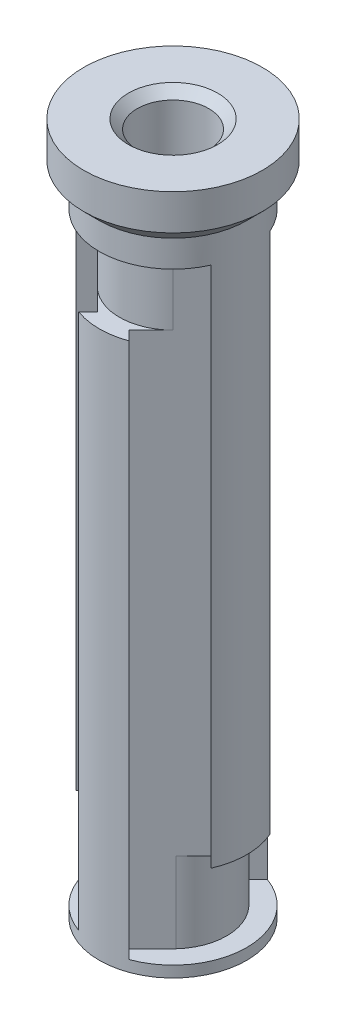
ISO-10303-21;
HEADER;
FILE_DESCRIPTION(('STEP AP214'),'2;1');
FILE_NAME('part.step','',(''),(''),'','','');
FILE_SCHEMA(('AUTOMOTIVE_DESIGN { 1 0 10303 214 1 1 1 1 }'));
ENDSEC;
DATA;
#1=APPLICATION_CONTEXT('core data for automotive mechanical design processes');
#2=APPLICATION_PROTOCOL_DEFINITION('international standard','automotive_design',2000,#1);
#3=PRODUCT_CONTEXT('',#1,'mechanical');
#4=PRODUCT('Part','Part','',(#3));
#5=PRODUCT_RELATED_PRODUCT_CATEGORY('part','',(#4));
#6=PRODUCT_DEFINITION_FORMATION('','',#4);
#7=PRODUCT_DEFINITION_CONTEXT('part definition',#1,'design');
#8=PRODUCT_DEFINITION('design','',#6,#7);
#9=PRODUCT_DEFINITION_SHAPE('','',#8);
#10=(LENGTH_UNIT() NAMED_UNIT(*) SI_UNIT(.MILLI.,.METRE.));
#11=(NAMED_UNIT(*) PLANE_ANGLE_UNIT() SI_UNIT($,.RADIAN.));
#12=(NAMED_UNIT(*) SI_UNIT($,.STERADIAN.) SOLID_ANGLE_UNIT());
#13=UNCERTAINTY_MEASURE_WITH_UNIT(LENGTH_MEASURE(1.E-05),#10,'distance_accuracy_value','');
#14=(GEOMETRIC_REPRESENTATION_CONTEXT(3) GLOBAL_UNCERTAINTY_ASSIGNED_CONTEXT((#13)) GLOBAL_UNIT_ASSIGNED_CONTEXT((#10,
#11,#12)) REPRESENTATION_CONTEXT('',''));
#15=CARTESIAN_POINT('',(0.,0.,0.));
#16=DIRECTION('',(0.,0.,1.));
#17=DIRECTION('',(1.,0.,0.));
#18=AXIS2_PLACEMENT_3D('',#15,#16,#17);
#19=CARTESIAN_POINT('',(0.,0.,0.));
#20=DIRECTION('',(0.,1.,0.));
#21=DIRECTION('',(0.,0.,1.));
#22=AXIS2_PLACEMENT_3D('',#19,#20,#21);
#23=CYLINDRICAL_SURFACE('',#22,8.25000000000001);
#24=CARTESIAN_POINT('',(0.,-5.75,0.));
#25=DIRECTION('',(0.,1.,0.));
#26=DIRECTION('',(0.,0.,1.));
#27=AXIS2_PLACEMENT_3D('',#24,#25,#26);
#28=CIRCLE('',#27,8.25);
#29=CARTESIAN_POINT('',(0.,-5.75,8.25));
#30=VERTEX_POINT('',#29);
#31=EDGE_CURVE('E315',#30,#30,#28,.T.);
#32=ORIENTED_EDGE('',*,*,#31,.F.);
#33=EDGE_LOOP('',(#32));
#34=FACE_BOUND('',#33,.T.);
#35=CARTESIAN_POINT('',(0.,-67.25,0.));
#36=DIRECTION('',(0.,1.,0.));
#37=DIRECTION('',(0.,0.,-1.));
#38=AXIS2_PLACEMENT_3D('',#35,#36,#37);
#39=CIRCLE('',#38,8.25000000000001);
#40=CARTESIAN_POINT('',(-7.5555866233807,-67.25,-3.31294593626136));
#41=VERTEX_POINT('',#40);
#42=CARTESIAN_POINT('',(-7.5555866233807,-67.25,3.31294593626136));
#43=VERTEX_POINT('',#42);
#44=EDGE_CURVE('E495',#41,#43,#39,.T.);
#45=ORIENTED_EDGE('',*,*,#44,.T.);
#46=DIRECTION('',(0.,1.,0.));
#47=VECTOR('',#46,1.);
#48=CARTESIAN_POINT('',(-7.5555866233807,-16.25,3.31294593626136));
#49=LINE('',#48,#47);
#50=CARTESIAN_POINT('',(-7.5555866233807,-8.75,3.31294593626136));
#51=VERTEX_POINT('',#50);
#52=EDGE_CURVE('E246',#43,#51,#49,.T.);
#53=ORIENTED_EDGE('',*,*,#52,.T.);
#54=CARTESIAN_POINT('',(0.,-8.75,0.));
#55=DIRECTION('',(0.,1.,0.));
#56=DIRECTION('',(0.,0.,1.));
#57=AXIS2_PLACEMENT_3D('',#54,#55,#56);
#58=CIRCLE('',#57,8.25000000000001);
#59=CARTESIAN_POINT('',(7.55558662338068,-8.75,3.31294593626142));
#60=VERTEX_POINT('',#59);
#61=EDGE_CURVE('E239',#60,#51,#58,.F.);
#62=ORIENTED_EDGE('',*,*,#61,.F.);
#63=DIRECTION('',(0.,1.,0.));
#64=VECTOR('',#63,1.);
#65=CARTESIAN_POINT('',(7.55558662338068,-16.25,3.31294593626142));
#66=LINE('',#65,#64);
#67=CARTESIAN_POINT('',(7.55558662338068,-67.25,3.31294593626141));
#68=VERTEX_POINT('',#67);
#69=EDGE_CURVE('E222',#68,#60,#66,.T.);
#70=ORIENTED_EDGE('',*,*,#69,.F.);
#71=CARTESIAN_POINT('',(0.,-67.25,0.));
#72=DIRECTION('',(0.,1.,0.));
#73=DIRECTION('',(0.,0.,1.));
#74=AXIS2_PLACEMENT_3D('',#71,#72,#73);
#75=CIRCLE('',#74,8.25000000000001);
#76=CARTESIAN_POINT('',(7.55558662338068,-67.25,-3.31294593626141));
#77=VERTEX_POINT('',#76);
#78=EDGE_CURVE('E430',#68,#77,#75,.T.);
#79=ORIENTED_EDGE('',*,*,#78,.T.);
#80=DIRECTION('',(0.,1.,0.));
#81=VECTOR('',#80,1.);
#82=CARTESIAN_POINT('',(7.55558662338068,-16.25,-3.31294593626142));
#83=LINE('',#82,#81);
#84=CARTESIAN_POINT('',(7.55558662338068,-8.75,-3.31294593626142));
#85=VERTEX_POINT('',#84);
#86=EDGE_CURVE('E305',#77,#85,#83,.T.);
#87=ORIENTED_EDGE('',*,*,#86,.T.);
#88=CARTESIAN_POINT('',(0.,-8.75,0.));
#89=DIRECTION('',(0.,1.,0.));
#90=DIRECTION('',(0.,0.,1.));
#91=AXIS2_PLACEMENT_3D('',#88,#89,#90);
#92=CIRCLE('',#91,8.25000000000001);
#93=CARTESIAN_POINT('',(-7.55558662338071,-8.75,-3.31294593626136));
#94=VERTEX_POINT('',#93);
#95=EDGE_CURVE('E289',#85,#94,#92,.T.);
#96=ORIENTED_EDGE('',*,*,#95,.T.);
#97=DIRECTION('',(0.,1.,0.));
#98=VECTOR('',#97,1.);
#99=CARTESIAN_POINT('',(-7.5555866233807,-16.25,-3.31294593626136));
#100=LINE('',#99,#98);
#101=EDGE_CURVE('E303',#41,#94,#100,.T.);
#102=ORIENTED_EDGE('',*,*,#101,.F.);
#103=EDGE_LOOP('',(#45,#53,#62,#70,#79,#87,#96,#102));
#104=FACE_BOUND('',#103,.T.);
#105=ADVANCED_FACE('F47',(#34,#104),#23,.T.);
#106=CARTESIAN_POINT('',(-4.24264068711931,-16.25,-4.24264068711927));
#107=DIRECTION('',(-0.707106781186551,0.,-0.707106781186544));
#108=DIRECTION('',(-0.707106781186544,0.,0.707106781186551));
#109=AXIS2_PLACEMENT_3D('',#106,#107,#108);
#110=PLANE('',#109);
#111=DIRECTION('',(0.707106781186543,0.,-0.707106781186552));
#112=VECTOR('',#111,1.);
#113=CARTESIAN_POINT('',(-6.36396103067894,-76.25,-2.12132034355961));
#114=LINE('',#113,#112);
#115=CARTESIAN_POINT('',(-4.41941738241596,-76.25,-4.06586399182261));
#116=VERTEX_POINT('',#115);
#117=CARTESIAN_POINT('',(-1.76776695296641,-76.25,-6.7175144212722));
#118=VERTEX_POINT('',#117);
#119=EDGE_CURVE('E85',#116,#118,#114,.T.);
#120=ORIENTED_EDGE('',*,*,#119,.F.);
#121=DIRECTION('',(0.,-1.,0.));
#122=VECTOR('',#121,1.);
#123=CARTESIAN_POINT('',(-4.41941738241596,-67.25,-4.06586399182261));
#124=LINE('',#123,#122);
#125=CARTESIAN_POINT('',(-4.41941738241598,-67.25,-4.06586399182259));
#126=VERTEX_POINT('',#125);
#127=EDGE_CURVE('E417',#116,#126,#124,.F.);
#128=ORIENTED_EDGE('',*,*,#127,.T.);
#129=DIRECTION('',(-0.707106781186544,0.,0.707106781186551));
#130=VECTOR('',#129,1.);
#131=CARTESIAN_POINT('',(-4.24264068711931,-67.25,-4.24264068711927));
#132=LINE('',#131,#130);
#133=CARTESIAN_POINT('',(-6.36396103067894,-67.25,-2.12132034355961));
#134=VERTEX_POINT('',#133);
#135=EDGE_CURVE('E426',#126,#134,#132,.T.);
#136=ORIENTED_EDGE('',*,*,#135,.T.);
#137=DIRECTION('',(0.,1.,0.));
#138=VECTOR('',#137,1.);
#139=CARTESIAN_POINT('',(-6.36396103067894,-16.25,-2.12132034355961));
#140=LINE('',#139,#138);
#141=CARTESIAN_POINT('',(-6.36396103067894,-8.75,-2.12132034355961));
#142=VERTEX_POINT('',#141);
#143=EDGE_CURVE('E301',#134,#142,#140,.T.);
#144=ORIENTED_EDGE('',*,*,#143,.T.);
#145=DIRECTION('',(-0.707106781186544,0.,0.707106781186551));
#146=VECTOR('',#145,1.);
#147=CARTESIAN_POINT('',(-4.24264068711931,-8.75,-4.24264068711927));
#148=LINE('',#147,#146);
#149=CARTESIAN_POINT('',(-4.24264068711931,-8.75,-4.24264068711926));
#150=VERTEX_POINT('',#149);
#151=EDGE_CURVE('E277',#150,#142,#148,.T.);
#152=ORIENTED_EDGE('',*,*,#151,.F.);
#153=DIRECTION('',(0.,1.,0.));
#154=VECTOR('',#153,1.);
#155=CARTESIAN_POINT('',(-4.24264068711931,-16.25,-4.24264068711926));
#156=LINE('',#155,#154);
#157=CARTESIAN_POINT('',(-4.24264068711931,-16.25,-4.24264068711926));
#158=VERTEX_POINT('',#157);
#159=EDGE_CURVE('E297',#158,#150,#156,.T.);
#160=ORIENTED_EDGE('',*,*,#159,.F.);
#161=DIRECTION('',(0.707106781186544,0.,-0.707106781186552));
#162=VECTOR('',#161,1.);
#163=CARTESIAN_POINT('',(-4.24264068711931,-16.25,-4.24264068711926));
#164=LINE('',#163,#162);
#165=CARTESIAN_POINT('',(-1.76776695296641,-16.25,-6.7175144212722));
#166=VERTEX_POINT('',#165);
#167=EDGE_CURVE('E324',#158,#166,#164,.T.);
#168=ORIENTED_EDGE('',*,*,#167,.T.);
#169=DIRECTION('',(0.,1.,0.));
#170=VECTOR('',#169,1.);
#171=CARTESIAN_POINT('',(-1.76776695296641,-76.25,-6.7175144212722));
#172=LINE('',#171,#170);
#173=EDGE_CURVE('E455',#118,#166,#172,.T.);
#174=ORIENTED_EDGE('',*,*,#173,.F.);
#175=EDGE_LOOP('',(#120,#128,#136,#144,#152,#160,#168,#174));
#176=FACE_BOUND('',#175,.T.);
#177=ADVANCED_FACE('F504',(#176),#110,.T.);
#178=CARTESIAN_POINT('',(-2.12132034355963,-16.25,2.12132034355965));
#179=DIRECTION('',(0.707106781186544,0.,-0.707106781186551));
#180=DIRECTION('',(-0.707106781186551,0.,-0.707106781186544));
#181=AXIS2_PLACEMENT_3D('',#178,#179,#180);
#182=PLANE('',#181);
#183=ORIENTED_EDGE('',*,*,#143,.F.);
#184=DIRECTION('',(-0.707106781186551,0.,-0.707106781186544));
#185=VECTOR('',#184,1.);
#186=CARTESIAN_POINT('',(-2.12132034355963,-67.25,2.12132034355965));
#187=LINE('',#186,#185);
#188=EDGE_CURVE('E419',#134,#41,#187,.T.);
#189=ORIENTED_EDGE('',*,*,#188,.T.);
#190=ORIENTED_EDGE('',*,*,#101,.T.);
#191=DIRECTION('',(-0.707106781186551,0.,-0.707106781186544));
#192=VECTOR('',#191,1.);
#193=CARTESIAN_POINT('',(-2.12132034355963,-8.75,2.12132034355965));
#194=LINE('',#193,#192);
#195=EDGE_CURVE('E292',#142,#94,#194,.T.);
#196=ORIENTED_EDGE('',*,*,#195,.F.);
#197=EDGE_LOOP('',(#183,#189,#190,#196));
#198=FACE_BOUND('',#197,.T.);
#199=ADVANCED_FACE('F494',(#198),#182,.T.);
#200=CARTESIAN_POINT('',(-2.12132034355963,-16.25,-2.12132034355965));
#201=DIRECTION('',(-0.707106781186544,0.,-0.707106781186551));
#202=DIRECTION('',(-0.707106781186551,0.,0.707106781186544));
#203=AXIS2_PLACEMENT_3D('',#200,#201,#202);
#204=PLANE('',#203);
#205=DIRECTION('',(-0.707106781186551,0.,0.707106781186544));
#206=VECTOR('',#205,1.);
#207=CARTESIAN_POINT('',(-2.12132034355963,-67.25,-2.12132034355965));
#208=LINE('',#207,#206);
#209=CARTESIAN_POINT('',(-6.36396103067894,-67.25,2.12132034355961));
#210=VERTEX_POINT('',#209);
#211=EDGE_CURVE('E105',#210,#43,#208,.T.);
#212=ORIENTED_EDGE('',*,*,#211,.F.);
#213=DIRECTION('',(0.,1.,0.));
#214=VECTOR('',#213,1.);
#215=CARTESIAN_POINT('',(-6.36396103067894,-16.25,2.12132034355961));
#216=LINE('',#215,#214);
#217=CARTESIAN_POINT('',(-6.36396103067894,-8.75,2.12132034355961));
#218=VERTEX_POINT('',#217);
#219=EDGE_CURVE('E266',#210,#218,#216,.T.);
#220=ORIENTED_EDGE('',*,*,#219,.T.);
#221=DIRECTION('',(-0.707106781186551,0.,0.707106781186544));
#222=VECTOR('',#221,1.);
#223=CARTESIAN_POINT('',(-2.12132034355963,-8.75,-2.12132034355965));
#224=LINE('',#223,#222);
#225=EDGE_CURVE('E261',#218,#51,#224,.T.);
#226=ORIENTED_EDGE('',*,*,#225,.T.);
#227=ORIENTED_EDGE('',*,*,#52,.F.);
#228=EDGE_LOOP('',(#212,#220,#226,#227));
#229=FACE_BOUND('',#228,.T.);
#230=ADVANCED_FACE('F412',(#229),#204,.F.);
#231=CARTESIAN_POINT('',(-4.2426406871193,-16.25,4.24264068711927));
#232=DIRECTION('',(0.707106781186551,0.,-0.707106781186544));
#233=DIRECTION('',(-0.707106781186544,0.,-0.707106781186551));
#234=AXIS2_PLACEMENT_3D('',#231,#232,#233);
#235=PLANE('',#234);
#236=DIRECTION('',(0.,-1.,0.));
#237=VECTOR('',#236,1.);
#238=CARTESIAN_POINT('',(-4.41941738241601,-67.25,4.06586399182256));
#239=LINE('',#238,#237);
#240=CARTESIAN_POINT('',(-4.41941738241597,-76.25,4.0658639918226));
#241=VERTEX_POINT('',#240);
#242=CARTESIAN_POINT('',(-4.41941738241601,-67.25,4.06586399182256));
#243=VERTEX_POINT('',#242);
#244=EDGE_CURVE('E415',#241,#243,#239,.F.);
#245=ORIENTED_EDGE('',*,*,#244,.F.);
#246=DIRECTION('',(-0.707106781186543,0.,-0.707106781186552));
#247=VECTOR('',#246,1.);
#248=CARTESIAN_POINT('',(-6.36396103067894,-76.25,2.12132034355961));
#249=LINE('',#248,#247);
#250=CARTESIAN_POINT('',(-1.76776695296641,-76.25,6.7175144212722));
#251=VERTEX_POINT('',#250);
#252=EDGE_CURVE('E96',#251,#241,#249,.T.);
#253=ORIENTED_EDGE('',*,*,#252,.F.);
#254=DIRECTION('',(0.,1.,0.));
#255=VECTOR('',#254,1.);
#256=CARTESIAN_POINT('',(-1.76776695296641,-76.25,6.7175144212722));
#257=LINE('',#256,#255);
#258=CARTESIAN_POINT('',(-1.76776695296641,-16.25,6.7175144212722));
#259=VERTEX_POINT('',#258);
#260=EDGE_CURVE('E360',#251,#259,#257,.T.);
#261=ORIENTED_EDGE('',*,*,#260,.T.);
#262=DIRECTION('',(-0.707106781186543,0.,-0.707106781186552));
#263=VECTOR('',#262,1.);
#264=CARTESIAN_POINT('',(-6.36396103067894,-16.25,2.12132034355961));
#265=LINE('',#264,#263);
#266=CARTESIAN_POINT('',(-4.24264068711931,-16.25,4.24264068711926));
#267=VERTEX_POINT('',#266);
#268=EDGE_CURVE('E401',#259,#267,#265,.T.);
#269=ORIENTED_EDGE('',*,*,#268,.T.);
#270=DIRECTION('',(0.,1.,0.));
#271=VECTOR('',#270,1.);
#272=CARTESIAN_POINT('',(-4.24264068711931,-16.25,4.24264068711926));
#273=LINE('',#272,#271);
#274=CARTESIAN_POINT('',(-4.24264068711931,-8.75,4.24264068711926));
#275=VERTEX_POINT('',#274);
#276=EDGE_CURVE('E268',#267,#275,#273,.T.);
#277=ORIENTED_EDGE('',*,*,#276,.T.);
#278=DIRECTION('',(-0.707106781186544,0.,-0.707106781186551));
#279=VECTOR('',#278,1.);
#280=CARTESIAN_POINT('',(-4.2426406871193,-8.75,4.24264068711927));
#281=LINE('',#280,#279);
#282=EDGE_CURVE('E258',#275,#218,#281,.T.);
#283=ORIENTED_EDGE('',*,*,#282,.T.);
#284=ORIENTED_EDGE('',*,*,#219,.F.);
#285=DIRECTION('',(-0.707106781186544,0.,-0.707106781186551));
#286=VECTOR('',#285,1.);
#287=CARTESIAN_POINT('',(-4.2426406871193,-67.25,4.24264068711927));
#288=LINE('',#287,#286);
#289=EDGE_CURVE('E414',#243,#210,#288,.T.);
#290=ORIENTED_EDGE('',*,*,#289,.F.);
#291=EDGE_LOOP('',(#245,#253,#261,#269,#277,#283,#284,#290));
#292=FACE_BOUND('',#291,.T.);
#293=ADVANCED_FACE('F354',(#292),#235,.F.);
#294=CARTESIAN_POINT('',(0.,-77.5,0.));
#295=DIRECTION('',(0.,1.,0.));
#296=DIRECTION('',(0.,0.,1.));
#297=AXIS2_PLACEMENT_3D('',#294,#295,#296);
#298=CIRCLE('',#297,8.25000000000001);
#299=CARTESIAN_POINT('',(0.,-77.5,8.25000000000001));
#300=VERTEX_POINT('',#299);
#301=EDGE_CURVE('E318',#300,#300,#298,.T.);
#302=ORIENTED_EDGE('',*,*,#301,.T.);
#303=EDGE_LOOP('',(#302));
#304=FACE_BOUND('',#303,.T.);
#305=DIRECTION('',(0.,1.,0.));
#306=VECTOR('',#305,1.);
#307=CARTESIAN_POINT('',(-2.80776291812599,-76.25,7.75751038643177));
#308=LINE('',#307,#306);
#309=CARTESIAN_POINT('',(-2.80776291812599,-76.25,7.75751038643177));
#310=VERTEX_POINT('',#309);
#311=CARTESIAN_POINT('',(-2.80776291812599,-16.25,7.75751038643177));
#312=VERTEX_POINT('',#311);
#313=EDGE_CURVE('E64',#310,#312,#308,.T.);
#314=ORIENTED_EDGE('',*,*,#313,.F.);
#315=CARTESIAN_POINT('',(0.,-76.25,0.));
#316=DIRECTION('',(0.,1.,0.));
#317=DIRECTION('',(0.,0.,-1.));
#318=AXIS2_PLACEMENT_3D('',#315,#316,#317);
#319=CIRCLE('',#318,8.25);
#320=CARTESIAN_POINT('',(-2.80776291812599,-76.25,-7.75751038643177));
#321=VERTEX_POINT('',#320);
#322=EDGE_CURVE('E358',#321,#310,#319,.T.);
#323=ORIENTED_EDGE('',*,*,#322,.F.);
#324=DIRECTION('',(0.,1.,0.));
#325=VECTOR('',#324,1.);
#326=CARTESIAN_POINT('',(-2.80776291812599,-76.25,-7.75751038643177));
#327=LINE('',#326,#325);
#328=CARTESIAN_POINT('',(-2.80776291812599,-16.25,-7.75751038643177));
#329=VERTEX_POINT('',#328);
#330=EDGE_CURVE('E394',#321,#329,#327,.T.);
#331=ORIENTED_EDGE('',*,*,#330,.T.);
#332=CARTESIAN_POINT('',(0.,-16.25,0.));
#333=DIRECTION('',(0.,1.,0.));
#334=DIRECTION('',(0.,0.,1.));
#335=AXIS2_PLACEMENT_3D('',#332,#333,#334);
#336=CIRCLE('',#335,8.25000000000001);
#337=CARTESIAN_POINT('',(2.80776291812594,-16.25,-7.75751038643179));
#338=VERTEX_POINT('',#337);
#339=EDGE_CURVE('E276',#338,#329,#336,.T.);
#340=ORIENTED_EDGE('',*,*,#339,.F.);
#341=DIRECTION('',(0.,1.,0.));
#342=VECTOR('',#341,1.);
#343=CARTESIAN_POINT('',(2.80776291812594,-76.25,-7.75751038643178));
#344=LINE('',#343,#342);
#345=CARTESIAN_POINT('',(2.80776291812594,-76.25,-7.75751038643178));
#346=VERTEX_POINT('',#345);
#347=EDGE_CURVE('E249',#346,#338,#344,.T.);
#348=ORIENTED_EDGE('',*,*,#347,.F.);
#349=CARTESIAN_POINT('',(0.,-76.25,0.));
#350=DIRECTION('',(0.,1.,0.));
#351=DIRECTION('',(0.,0.,1.));
#352=AXIS2_PLACEMENT_3D('',#349,#350,#351);
#353=CIRCLE('',#352,8.25000000000001);
#354=CARTESIAN_POINT('',(2.80776291812594,-76.25,7.75751038643178));
#355=VERTEX_POINT('',#354);
#356=EDGE_CURVE('E382',#355,#346,#353,.T.);
#357=ORIENTED_EDGE('',*,*,#356,.F.);
#358=DIRECTION('',(0.,1.,0.));
#359=VECTOR('',#358,1.);
#360=CARTESIAN_POINT('',(2.80776291812594,-76.25,7.75751038643178));
#361=LINE('',#360,#359);
#362=CARTESIAN_POINT('',(2.80776291812594,-16.25,7.75751038643178));
#363=VERTEX_POINT('',#362);
#364=EDGE_CURVE('E378',#355,#363,#361,.T.);
#365=ORIENTED_EDGE('',*,*,#364,.T.);
#366=CARTESIAN_POINT('',(0.,-16.25,0.));
#367=DIRECTION('',(0.,1.,0.));
#368=DIRECTION('',(0.,0.,1.));
#369=AXIS2_PLACEMENT_3D('',#366,#367,#368);
#370=CIRCLE('',#369,8.25000000000001);
#371=EDGE_CURVE('E263',#363,#312,#370,.F.);
#372=ORIENTED_EDGE('',*,*,#371,.T.);
#373=EDGE_LOOP('',(#314,#323,#331,#340,#348,#357,#365,#372));
#374=FACE_BOUND('',#373,.T.);
#375=ADVANCED_FACE('F351',(#304,#374),#23,.T.);
#376=CARTESIAN_POINT('',(0.,0.,0.));
#377=DIRECTION('',(0.,1.,0.));
#378=DIRECTION('',(0.,0.,1.));
#379=AXIS2_PLACEMENT_3D('',#376,#377,#378);
#380=CYLINDRICAL_SURFACE('',#379,4.);
#381=CARTESIAN_POINT('',(0.,-79.,0.));
#382=DIRECTION('',(0.,1.,0.));
#383=DIRECTION('',(0.,0.,1.));
#384=AXIS2_PLACEMENT_3D('',#381,#382,#383);
#385=CIRCLE('',#384,4.);
#386=CARTESIAN_POINT('',(0.,-79.,4.));
#387=VERTEX_POINT('',#386);
#388=EDGE_CURVE('E56',#387,#387,#385,.F.);
#389=ORIENTED_EDGE('',*,*,#388,.T.);
#390=EDGE_LOOP('',(#389));
#391=FACE_BOUND('',#390,.T.);
#392=CARTESIAN_POINT('',(0.,-1.00000000000001,0.));
#393=DIRECTION('',(0.,-1.,0.));
#394=DIRECTION('',(0.,0.,-1.));
#395=AXIS2_PLACEMENT_3D('',#392,#393,#394);
#396=CIRCLE('',#395,4.);
#397=CARTESIAN_POINT('',(0.,-1.00000000000001,-4.));
#398=VERTEX_POINT('',#397);
#399=EDGE_CURVE('E330',#398,#398,#396,.F.);
#400=ORIENTED_EDGE('',*,*,#399,.T.);
#401=EDGE_LOOP('',(#400));
#402=FACE_BOUND('',#401,.T.);
#403=ADVANCED_FACE('F335',(#391,#402),#380,.F.);
#404=CARTESIAN_POINT('',(0.,-80.,0.));
#405=DIRECTION('',(0.,1.,0.));
#406=DIRECTION('',(0.,0.,1.));
#407=AXIS2_PLACEMENT_3D('',#404,#405,#406);
#408=CONICAL_SURFACE('',#407,4.00000000000001,1.03907225953609);
#409=CARTESIAN_POINT('',(0.,-79.6296296296296,0.));
#410=DIRECTION('',(0.,-1.,0.));
#411=DIRECTION('',(0.,0.,-1.));
#412=AXIS2_PLACEMENT_3D('',#409,#410,#411);
#413=CIRCLE('',#412,4.62962962962964);
#414=CARTESIAN_POINT('',(0.,-79.6296296296296,-4.62962962962964));
#415=VERTEX_POINT('',#414);
#416=EDGE_CURVE('E327',#415,#415,#413,.F.);
#417=ORIENTED_EDGE('',*,*,#416,.T.);
#418=EDGE_LOOP('',(#417));
#419=FACE_BOUND('',#418,.T.);
#420=ORIENTED_EDGE('',*,*,#301,.F.);
#421=EDGE_LOOP('',(#420));
#422=FACE_BOUND('',#421,.T.);
#423=ADVANCED_FACE('F344',(#419,#422),#408,.T.);
#424=CARTESIAN_POINT('',(0.,-5.75,0.));
#425=DIRECTION('',(0.,1.,0.));
#426=DIRECTION('',(0.,0.,1.));
#427=AXIS2_PLACEMENT_3D('',#424,#425,#426);
#428=CONICAL_SURFACE('',#427,8.25,0.785398163397448);
#429=CARTESIAN_POINT('',(0.,-4.,0.));
#430=DIRECTION('',(0.,1.,0.));
#431=DIRECTION('',(0.,0.,1.));
#432=AXIS2_PLACEMENT_3D('',#429,#430,#431);
#433=CIRCLE('',#432,10.);
#434=CARTESIAN_POINT('',(0.,-4.,10.));
#435=VERTEX_POINT('',#434);
#436=EDGE_CURVE('E312',#435,#435,#433,.T.);
#437=ORIENTED_EDGE('',*,*,#436,.F.);
#438=EDGE_LOOP('',(#437));
#439=FACE_BOUND('',#438,.T.);
#440=ORIENTED_EDGE('',*,*,#31,.T.);
#441=EDGE_LOOP('',(#440));
#442=FACE_BOUND('',#441,.T.);
#443=ADVANCED_FACE('F347',(#439,#442),#428,.T.);
#444=CARTESIAN_POINT('',(0.,0.,0.));
#445=DIRECTION('',(0.,1.,0.));
#446=DIRECTION('',(0.,0.,1.));
#447=AXIS2_PLACEMENT_3D('',#444,#445,#446);
#448=CYLINDRICAL_SURFACE('',#447,10.);
#449=CARTESIAN_POINT('',(0.,0.,0.));
#450=DIRECTION('',(0.,1.,0.));
#451=DIRECTION('',(0.,0.,1.));
#452=AXIS2_PLACEMENT_3D('',#449,#450,#451);
#453=CIRCLE('',#452,10.);
#454=CARTESIAN_POINT('',(0.,0.,10.));
#455=VERTEX_POINT('',#454);
#456=EDGE_CURVE('E300',#455,#455,#453,.T.);
#457=ORIENTED_EDGE('',*,*,#456,.F.);
#458=EDGE_LOOP('',(#457));
#459=FACE_BOUND('',#458,.T.);
#460=ORIENTED_EDGE('',*,*,#436,.T.);
#461=EDGE_LOOP('',(#460));
#462=FACE_BOUND('',#461,.T.);
#463=ADVANCED_FACE('F548',(#459,#462),#448,.T.);
#464=CARTESIAN_POINT('',(4.,0.,0.));
#465=DIRECTION('',(0.,-1.,0.));
#466=DIRECTION('',(0.,0.,-1.));
#467=AXIS2_PLACEMENT_3D('',#464,#465,#466);
#468=PLANE('',#467);
#469=CARTESIAN_POINT('',(0.,0.,0.));
#470=DIRECTION('',(0.,-1.,0.));
#471=DIRECTION('',(0.,0.,-1.));
#472=AXIS2_PLACEMENT_3D('',#469,#470,#471);
#473=CIRCLE('',#472,5.00000000000001);
#474=CARTESIAN_POINT('',(0.,0.,-5.00000000000001));
#475=VERTEX_POINT('',#474);
#476=EDGE_CURVE('E11',#475,#475,#473,.T.);
#477=ORIENTED_EDGE('',*,*,#476,.T.);
#478=EDGE_LOOP('',(#477));
#479=FACE_BOUND('',#478,.T.);
#480=ORIENTED_EDGE('',*,*,#456,.T.);
#481=EDGE_LOOP('',(#480));
#482=FACE_BOUND('',#481,.T.);
#483=ADVANCED_FACE('F544',(#479,#482),#468,.F.);
#484=CARTESIAN_POINT('',(0.,-16.25,0.));
#485=DIRECTION('',(0.,1.,0.));
#486=DIRECTION('',(0.,0.,1.));
#487=AXIS2_PLACEMENT_3D('',#484,#485,#486);
#488=CYLINDRICAL_SURFACE('',#487,6.);
#489=CARTESIAN_POINT('',(0.,-8.75,0.));
#490=DIRECTION('',(0.,1.,0.));
#491=DIRECTION('',(0.,0.,1.));
#492=AXIS2_PLACEMENT_3D('',#489,#490,#491);
#493=CIRCLE('',#492,6.);
#494=CARTESIAN_POINT('',(4.24264068711928,-8.75,-4.24264068711929));
#495=VERTEX_POINT('',#494);
#496=EDGE_CURVE('E265',#495,#150,#493,.T.);
#497=ORIENTED_EDGE('',*,*,#496,.F.);
#498=DIRECTION('',(0.,1.,0.));
#499=VECTOR('',#498,1.);
#500=CARTESIAN_POINT('',(4.24264068711928,-16.25,-4.24264068711929));
#501=LINE('',#500,#499);
#502=CARTESIAN_POINT('',(4.24264068711929,-16.25,-4.24264068711929));
#503=VERTEX_POINT('',#502);
#504=EDGE_CURVE('E280',#503,#495,#501,.T.);
#505=ORIENTED_EDGE('',*,*,#504,.F.);
#506=CARTESIAN_POINT('',(0.,-16.25,0.));
#507=DIRECTION('',(0.,1.,0.));
#508=DIRECTION('',(0.,0.,1.));
#509=AXIS2_PLACEMENT_3D('',#506,#507,#508);
#510=CIRCLE('',#509,6.);
#511=EDGE_CURVE('E273',#503,#158,#510,.T.);
#512=ORIENTED_EDGE('',*,*,#511,.T.);
#513=ORIENTED_EDGE('',*,*,#159,.T.);
#514=EDGE_LOOP('',(#497,#505,#512,#513));
#515=FACE_BOUND('',#514,.T.);
#516=ADVANCED_FACE('F547',(#515),#488,.T.);
#517=CARTESIAN_POINT('',(2.12132034355965,-16.25,2.12132034355964));
#518=DIRECTION('',(0.707106781186549,0.,0.707106781186546));
#519=DIRECTION('',(0.707106781186546,0.,-0.707106781186549));
#520=AXIS2_PLACEMENT_3D('',#517,#518,#519);
#521=PLANE('',#520);
#522=ORIENTED_EDGE('',*,*,#86,.F.);
#523=DIRECTION('',(-0.707106781186546,0.,0.707106781186549));
#524=VECTOR('',#523,1.);
#525=CARTESIAN_POINT('',(2.12132034355965,-67.25,2.12132034355964));
#526=LINE('',#525,#524);
#527=CARTESIAN_POINT('',(6.36396103067892,-67.25,-2.12132034355965));
#528=VERTEX_POINT('',#527);
#529=EDGE_CURVE('E377',#77,#528,#526,.T.);
#530=ORIENTED_EDGE('',*,*,#529,.T.);
#531=DIRECTION('',(0.,1.,0.));
#532=VECTOR('',#531,1.);
#533=CARTESIAN_POINT('',(6.36396103067892,-16.25,-2.12132034355965));
#534=LINE('',#533,#532);
#535=CARTESIAN_POINT('',(6.36396103067892,-8.75,-2.12132034355965));
#536=VERTEX_POINT('',#535);
#537=EDGE_CURVE('E307',#528,#536,#534,.T.);
#538=ORIENTED_EDGE('',*,*,#537,.T.);
#539=DIRECTION('',(0.707106781186546,0.,-0.707106781186549));
#540=VECTOR('',#539,1.);
#541=CARTESIAN_POINT('',(2.12132034355965,-8.75,2.12132034355964));
#542=LINE('',#541,#540);
#543=EDGE_CURVE('E286',#536,#85,#542,.T.);
#544=ORIENTED_EDGE('',*,*,#543,.T.);
#545=EDGE_LOOP('',(#522,#530,#538,#544));
#546=FACE_BOUND('',#545,.T.);
#547=ADVANCED_FACE('F484',(#546),#521,.F.);
#548=CARTESIAN_POINT('',(4.24264068711928,-16.25,-4.24264068711929));
#549=DIRECTION('',(-0.707106781186547,0.,0.707106781186548));
#550=DIRECTION('',(0.707106781186548,0.,0.707106781186547));
#551=AXIS2_PLACEMENT_3D('',#548,#549,#550);
#552=PLANE('',#551);
#553=DIRECTION('',(0.,-1.,0.));
#554=VECTOR('',#553,1.);
#555=CARTESIAN_POINT('',(4.41941738241594,-67.25,-4.06586399182263));
#556=LINE('',#555,#554);
#557=CARTESIAN_POINT('',(4.41941738241592,-76.25,-4.06586399182265));
#558=VERTEX_POINT('',#557);
#559=CARTESIAN_POINT('',(4.41941738241593,-67.25,-4.06586399182264));
#560=VERTEX_POINT('',#559);
#561=EDGE_CURVE('E440',#558,#560,#556,.F.);
#562=ORIENTED_EDGE('',*,*,#561,.F.);
#563=DIRECTION('',(0.707106781186548,0.,0.707106781186547));
#564=VECTOR('',#563,1.);
#565=CARTESIAN_POINT('',(6.36396103067892,-76.25,-2.12132034355965));
#566=LINE('',#565,#564);
#567=CARTESIAN_POINT('',(1.76776695296636,-76.25,-6.71751442127221));
#568=VERTEX_POINT('',#567);
#569=EDGE_CURVE('E389',#568,#558,#566,.T.);
#570=ORIENTED_EDGE('',*,*,#569,.F.);
#571=DIRECTION('',(0.,1.,0.));
#572=VECTOR('',#571,1.);
#573=CARTESIAN_POINT('',(1.76776695296636,-76.25,-6.71751442127221));
#574=LINE('',#573,#572);
#575=CARTESIAN_POINT('',(1.76776695296636,-16.25,-6.71751442127221));
#576=VERTEX_POINT('',#575);
#577=EDGE_CURVE('E247',#568,#576,#574,.T.);
#578=ORIENTED_EDGE('',*,*,#577,.T.);
#579=DIRECTION('',(0.707106781186548,0.,0.707106781186547));
#580=VECTOR('',#579,1.);
#581=CARTESIAN_POINT('',(6.36396103067892,-16.25,-2.12132034355965));
#582=LINE('',#581,#580);
#583=EDGE_CURVE('E386',#576,#503,#582,.T.);
#584=ORIENTED_EDGE('',*,*,#583,.T.);
#585=ORIENTED_EDGE('',*,*,#504,.T.);
#586=DIRECTION('',(0.707106781186548,0.,0.707106781186547));
#587=VECTOR('',#586,1.);
#588=CARTESIAN_POINT('',(4.24264068711928,-8.75,-4.24264068711929));
#589=LINE('',#588,#587);
#590=EDGE_CURVE('E283',#495,#536,#589,.T.);
#591=ORIENTED_EDGE('',*,*,#590,.T.);
#592=ORIENTED_EDGE('',*,*,#537,.F.);
#593=DIRECTION('',(-0.707106781186548,0.,-0.707106781186547));
#594=VECTOR('',#593,1.);
#595=CARTESIAN_POINT('',(4.24264068711928,-67.25,-4.24264068711929));
#596=LINE('',#595,#594);
#597=EDGE_CURVE('E445',#528,#560,#596,.T.);
#598=ORIENTED_EDGE('',*,*,#597,.T.);
#599=EDGE_LOOP('',(#562,#570,#578,#584,#585,#591,#592,#598));
#600=FACE_BOUND('',#599,.T.);
#601=ADVANCED_FACE('F480',(#600),#552,.F.);
#602=CARTESIAN_POINT('',(0.,-16.25,0.));
#603=DIRECTION('',(0.,1.,0.));
#604=DIRECTION('',(0.,0.,1.));
#605=AXIS2_PLACEMENT_3D('',#602,#603,#604);
#606=PLANE('',#605);
#607=DIRECTION('',(-0.707106781186552,0.,-0.707106781186543));
#608=VECTOR('',#607,1.);
#609=CARTESIAN_POINT('',(-1.76776695296641,-16.25,-6.7175144212722));
#610=LINE('',#609,#608);
#611=EDGE_CURVE('E362',#166,#329,#610,.T.);
#612=ORIENTED_EDGE('',*,*,#611,.F.);
#613=ORIENTED_EDGE('',*,*,#167,.F.);
#614=ORIENTED_EDGE('',*,*,#511,.F.);
#615=ORIENTED_EDGE('',*,*,#583,.F.);
#616=DIRECTION('',(-0.707106781186547,0.,0.707106781186548));
#617=VECTOR('',#616,1.);
#618=CARTESIAN_POINT('',(2.80776291812594,-16.25,-7.75751038643178));
#619=LINE('',#618,#617);
#620=EDGE_CURVE('E391',#338,#576,#619,.T.);
#621=ORIENTED_EDGE('',*,*,#620,.F.);
#622=ORIENTED_EDGE('',*,*,#339,.T.);
#623=EDGE_LOOP('',(#612,#613,#614,#615,#621,#622));
#624=FACE_BOUND('',#623,.T.);
#625=ADVANCED_FACE('F725',(#624),#606,.T.);
#626=CARTESIAN_POINT('',(0.,-8.75,0.));
#627=DIRECTION('',(0.,1.,0.));
#628=DIRECTION('',(0.,0.,1.));
#629=AXIS2_PLACEMENT_3D('',#626,#627,#628);
#630=PLANE('',#629);
#631=ORIENTED_EDGE('',*,*,#496,.T.);
#632=ORIENTED_EDGE('',*,*,#151,.T.);
#633=ORIENTED_EDGE('',*,*,#195,.T.);
#634=ORIENTED_EDGE('',*,*,#95,.F.);
#635=ORIENTED_EDGE('',*,*,#543,.F.);
#636=ORIENTED_EDGE('',*,*,#590,.F.);
#637=EDGE_LOOP('',(#631,#632,#633,#634,#635,#636));
#638=FACE_BOUND('',#637,.T.);
#639=ADVANCED_FACE('F489',(#638),#630,.F.);
#640=CARTESIAN_POINT('',(0.,-16.25,0.));
#641=DIRECTION('',(0.,1.,0.));
#642=DIRECTION('',(0.,0.,1.));
#643=AXIS2_PLACEMENT_3D('',#640,#641,#642);
#644=CYLINDRICAL_SURFACE('',#643,6.);
#645=CARTESIAN_POINT('',(0.,-8.75,0.));
#646=DIRECTION('',(0.,1.,0.));
#647=DIRECTION('',(0.,0.,1.));
#648=AXIS2_PLACEMENT_3D('',#645,#646,#647);
#649=CIRCLE('',#648,6.);
#650=CARTESIAN_POINT('',(4.24264068711928,-8.75,4.24264068711929));
#651=VERTEX_POINT('',#650);
#652=EDGE_CURVE('E255',#651,#275,#649,.F.);
#653=ORIENTED_EDGE('',*,*,#652,.T.);
#654=ORIENTED_EDGE('',*,*,#276,.F.);
#655=CARTESIAN_POINT('',(0.,-16.25,0.));
#656=DIRECTION('',(0.,1.,0.));
#657=DIRECTION('',(0.,0.,1.));
#658=AXIS2_PLACEMENT_3D('',#655,#656,#657);
#659=CIRCLE('',#658,6.);
#660=CARTESIAN_POINT('',(4.24264068711929,-16.25,4.24264068711929));
#661=VERTEX_POINT('',#660);
#662=EDGE_CURVE('E232',#661,#267,#659,.F.);
#663=ORIENTED_EDGE('',*,*,#662,.F.);
#664=DIRECTION('',(0.,1.,0.));
#665=VECTOR('',#664,1.);
#666=CARTESIAN_POINT('',(4.24264068711928,-16.25,4.24264068711929));
#667=LINE('',#666,#665);
#668=EDGE_CURVE('E270',#661,#651,#667,.T.);
#669=ORIENTED_EDGE('',*,*,#668,.T.);
#670=EDGE_LOOP('',(#653,#654,#663,#669));
#671=FACE_BOUND('',#670,.T.);
#672=ADVANCED_FACE('F406',(#671),#644,.T.);
#673=CARTESIAN_POINT('',(4.24264068711928,-16.25,4.24264068711929));
#674=DIRECTION('',(0.707106781186546,0.,0.707106781186549));
#675=DIRECTION('',(0.707106781186549,0.,-0.707106781186546));
#676=AXIS2_PLACEMENT_3D('',#673,#674,#675);
#677=PLANE('',#676);
#678=DIRECTION('',(-0.707106781186548,0.,0.707106781186547));
#679=VECTOR('',#678,1.);
#680=CARTESIAN_POINT('',(6.36396103067892,-76.25,2.12132034355965));
#681=LINE('',#680,#679);
#682=CARTESIAN_POINT('',(4.41941738241593,-76.25,4.06586399182264));
#683=VERTEX_POINT('',#682);
#684=CARTESIAN_POINT('',(1.76776695296636,-76.25,6.71751442127221));
#685=VERTEX_POINT('',#684);
#686=EDGE_CURVE('E368',#683,#685,#681,.T.);
#687=ORIENTED_EDGE('',*,*,#686,.F.);
#688=DIRECTION('',(0.,-1.,0.));
#689=VECTOR('',#688,1.);
#690=CARTESIAN_POINT('',(4.41941738241594,-67.25,4.06586399182264));
#691=LINE('',#690,#689);
#692=CARTESIAN_POINT('',(4.41941738241596,-67.25,4.06586399182262));
#693=VERTEX_POINT('',#692);
#694=EDGE_CURVE('E435',#683,#693,#691,.F.);
#695=ORIENTED_EDGE('',*,*,#694,.T.);
#696=DIRECTION('',(-0.707106781186549,0.,0.707106781186546));
#697=VECTOR('',#696,1.);
#698=CARTESIAN_POINT('',(4.24264068711928,-67.25,4.24264068711929));
#699=LINE('',#698,#697);
#700=CARTESIAN_POINT('',(6.36396103067892,-67.25,2.12132034355965));
#701=VERTEX_POINT('',#700);
#702=EDGE_CURVE('E443',#701,#693,#699,.T.);
#703=ORIENTED_EDGE('',*,*,#702,.F.);
#704=DIRECTION('',(0.,1.,0.));
#705=VECTOR('',#704,1.);
#706=CARTESIAN_POINT('',(6.36396103067892,-16.25,2.12132034355965));
#707=LINE('',#706,#705);
#708=CARTESIAN_POINT('',(6.36396103067892,-8.75,2.12132034355965));
#709=VERTEX_POINT('',#708);
#710=EDGE_CURVE('E231',#701,#709,#707,.T.);
#711=ORIENTED_EDGE('',*,*,#710,.T.);
#712=DIRECTION('',(0.707106781186549,0.,-0.707106781186546));
#713=VECTOR('',#712,1.);
#714=CARTESIAN_POINT('',(4.24264068711928,-8.75,4.24264068711929));
#715=LINE('',#714,#713);
#716=EDGE_CURVE('E243',#651,#709,#715,.T.);
#717=ORIENTED_EDGE('',*,*,#716,.F.);
#718=ORIENTED_EDGE('',*,*,#668,.F.);
#719=DIRECTION('',(-0.707106781186548,0.,0.707106781186547));
#720=VECTOR('',#719,1.);
#721=CARTESIAN_POINT('',(4.24264068711929,-16.25,4.24264068711929));
#722=LINE('',#721,#720);
#723=CARTESIAN_POINT('',(1.76776695296636,-16.25,6.71751442127221));
#724=VERTEX_POINT('',#723);
#725=EDGE_CURVE('E321',#661,#724,#722,.T.);
#726=ORIENTED_EDGE('',*,*,#725,.T.);
#727=DIRECTION('',(0.,1.,0.));
#728=VECTOR('',#727,1.);
#729=CARTESIAN_POINT('',(1.76776695296636,-76.25,6.71751442127221));
#730=LINE('',#729,#728);
#731=EDGE_CURVE('E374',#685,#724,#730,.T.);
#732=ORIENTED_EDGE('',*,*,#731,.F.);
#733=EDGE_LOOP('',(#687,#695,#703,#711,#717,#718,#726,#732));
#734=FACE_BOUND('',#733,.T.);
#735=ADVANCED_FACE('F468',(#734),#677,.T.);
#736=CARTESIAN_POINT('',(2.12132034355965,-16.25,-2.12132034355964));
#737=DIRECTION('',(-0.707106781186549,0.,0.707106781186546));
#738=DIRECTION('',(0.707106781186546,0.,0.707106781186549));
#739=AXIS2_PLACEMENT_3D('',#736,#737,#738);
#740=PLANE('',#739);
#741=DIRECTION('',(-0.707106781186546,0.,-0.707106781186549));
#742=VECTOR('',#741,1.);
#743=CARTESIAN_POINT('',(2.12132034355965,-67.25,-2.12132034355964));
#744=LINE('',#743,#742);
#745=EDGE_CURVE('E227',#68,#701,#744,.T.);
#746=ORIENTED_EDGE('',*,*,#745,.F.);
#747=ORIENTED_EDGE('',*,*,#69,.T.);
#748=DIRECTION('',(0.707106781186546,0.,0.707106781186549));
#749=VECTOR('',#748,1.);
#750=CARTESIAN_POINT('',(2.12132034355965,-8.75,-2.12132034355964));
#751=LINE('',#750,#749);
#752=EDGE_CURVE('E226',#709,#60,#751,.T.);
#753=ORIENTED_EDGE('',*,*,#752,.F.);
#754=ORIENTED_EDGE('',*,*,#710,.F.);
#755=EDGE_LOOP('',(#746,#747,#753,#754));
#756=FACE_BOUND('',#755,.T.);
#757=ADVANCED_FACE('F224',(#756),#740,.T.);
#758=CARTESIAN_POINT('',(0.,-16.25,0.));
#759=DIRECTION('',(0.,1.,0.));
#760=DIRECTION('',(0.,0.,1.));
#761=AXIS2_PLACEMENT_3D('',#758,#759,#760);
#762=PLANE('',#761);
#763=ORIENTED_EDGE('',*,*,#268,.F.);
#764=DIRECTION('',(0.707106781186552,0.,-0.707106781186543));
#765=VECTOR('',#764,1.);
#766=CARTESIAN_POINT('',(-1.76776695296641,-16.25,6.7175144212722));
#767=LINE('',#766,#765);
#768=EDGE_CURVE('E380',#312,#259,#767,.T.);
#769=ORIENTED_EDGE('',*,*,#768,.F.);
#770=ORIENTED_EDGE('',*,*,#371,.F.);
#771=DIRECTION('',(0.707106781186547,0.,0.707106781186548));
#772=VECTOR('',#771,1.);
#773=CARTESIAN_POINT('',(2.80776291812594,-16.25,7.75751038643178));
#774=LINE('',#773,#772);
#775=EDGE_CURVE('E371',#724,#363,#774,.T.);
#776=ORIENTED_EDGE('',*,*,#775,.F.);
#777=ORIENTED_EDGE('',*,*,#725,.F.);
#778=ORIENTED_EDGE('',*,*,#662,.T.);
#779=EDGE_LOOP('',(#763,#769,#770,#776,#777,#778));
#780=FACE_BOUND('',#779,.T.);
#781=ADVANCED_FACE('F400',(#780),#762,.T.);
#782=CARTESIAN_POINT('',(0.,-8.75,0.));
#783=DIRECTION('',(0.,1.,0.));
#784=DIRECTION('',(0.,0.,1.));
#785=AXIS2_PLACEMENT_3D('',#782,#783,#784);
#786=PLANE('',#785);
#787=ORIENTED_EDGE('',*,*,#61,.T.);
#788=ORIENTED_EDGE('',*,*,#225,.F.);
#789=ORIENTED_EDGE('',*,*,#282,.F.);
#790=ORIENTED_EDGE('',*,*,#652,.F.);
#791=ORIENTED_EDGE('',*,*,#716,.T.);
#792=ORIENTED_EDGE('',*,*,#752,.T.);
#793=EDGE_LOOP('',(#787,#788,#789,#790,#791,#792));
#794=FACE_BOUND('',#793,.T.);
#795=ADVANCED_FACE('F237',(#794),#786,.F.);
#796=CARTESIAN_POINT('',(2.80776291812594,-76.25,-7.75751038643178));
#797=DIRECTION('',(-0.707106781186548,0.,-0.707106781186547));
#798=DIRECTION('',(-0.707106781186547,0.,0.707106781186548));
#799=AXIS2_PLACEMENT_3D('',#796,#797,#798);
#800=PLANE('',#799);
#801=ORIENTED_EDGE('',*,*,#620,.T.);
#802=ORIENTED_EDGE('',*,*,#577,.F.);
#803=DIRECTION('',(-0.707106781186547,0.,0.707106781186548));
#804=VECTOR('',#803,1.);
#805=CARTESIAN_POINT('',(2.80776291812594,-76.25,-7.75751038643178));
#806=LINE('',#805,#804);
#807=EDGE_CURVE('E385',#346,#568,#806,.T.);
#808=ORIENTED_EDGE('',*,*,#807,.F.);
#809=ORIENTED_EDGE('',*,*,#347,.T.);
#810=EDGE_LOOP('',(#801,#802,#808,#809));
#811=FACE_BOUND('',#810,.T.);
#812=ADVANCED_FACE('F670',(#811),#800,.F.);
#813=CARTESIAN_POINT('',(0.,-76.25,0.));
#814=DIRECTION('',(0.,1.,0.));
#815=DIRECTION('',(0.,0.,1.));
#816=AXIS2_PLACEMENT_3D('',#813,#814,#815);
#817=PLANE('',#816);
#818=DIRECTION('',(0.707106781186547,0.,0.707106781186548));
#819=VECTOR('',#818,1.);
#820=CARTESIAN_POINT('',(2.80776291812594,-76.25,7.75751038643178));
#821=LINE('',#820,#819);
#822=EDGE_CURVE('E370',#685,#355,#821,.T.);
#823=ORIENTED_EDGE('',*,*,#822,.T.);
#824=ORIENTED_EDGE('',*,*,#356,.T.);
#825=ORIENTED_EDGE('',*,*,#807,.T.);
#826=ORIENTED_EDGE('',*,*,#569,.T.);
#827=CARTESIAN_POINT('',(0.,-76.25,0.));
#828=DIRECTION('',(0.,-1.,0.));
#829=DIRECTION('',(0.,0.,1.));
#830=AXIS2_PLACEMENT_3D('',#827,#828,#829);
#831=CIRCLE('',#830,6.00520607473216);
#832=EDGE_CURVE('E429',#558,#683,#831,.T.);
#833=ORIENTED_EDGE('',*,*,#832,.T.);
#834=ORIENTED_EDGE('',*,*,#686,.T.);
#835=EDGE_LOOP('',(#823,#824,#825,#826,#833,#834));
#836=FACE_BOUND('',#835,.T.);
#837=ADVANCED_FACE('F662',(#836),#817,.T.);
#838=CARTESIAN_POINT('',(2.80776291812594,-76.25,7.75751038643178));
#839=DIRECTION('',(-0.707106781186548,0.,0.707106781186547));
#840=DIRECTION('',(0.707106781186547,0.,0.707106781186548));
#841=AXIS2_PLACEMENT_3D('',#838,#839,#840);
#842=PLANE('',#841);
#843=ORIENTED_EDGE('',*,*,#775,.T.);
#844=ORIENTED_EDGE('',*,*,#364,.F.);
#845=ORIENTED_EDGE('',*,*,#822,.F.);
#846=ORIENTED_EDGE('',*,*,#731,.T.);
#847=EDGE_LOOP('',(#843,#844,#845,#846));
#848=FACE_BOUND('',#847,.T.);
#849=ADVANCED_FACE('F464',(#848),#842,.F.);
#850=CARTESIAN_POINT('',(-1.76776695296641,-76.25,6.7175144212722));
#851=DIRECTION('',(0.707106781186543,0.,0.707106781186552));
#852=DIRECTION('',(0.707106781186552,0.,-0.707106781186543));
#853=AXIS2_PLACEMENT_3D('',#850,#851,#852);
#854=PLANE('',#853);
#855=ORIENTED_EDGE('',*,*,#313,.T.);
#856=ORIENTED_EDGE('',*,*,#768,.T.);
#857=ORIENTED_EDGE('',*,*,#260,.F.);
#858=DIRECTION('',(0.707106781186552,0.,-0.707106781186543));
#859=VECTOR('',#858,1.);
#860=CARTESIAN_POINT('',(-1.76776695296641,-76.25,6.7175144212722));
#861=LINE('',#860,#859);
#862=EDGE_CURVE('E364',#310,#251,#861,.T.);
#863=ORIENTED_EDGE('',*,*,#862,.F.);
#864=EDGE_LOOP('',(#855,#856,#857,#863));
#865=FACE_BOUND('',#864,.T.);
#866=ADVANCED_FACE('F461',(#865),#854,.F.);
#867=CARTESIAN_POINT('',(-1.76776695296641,-76.25,-6.7175144212722));
#868=DIRECTION('',(0.707106781186543,0.,-0.707106781186552));
#869=DIRECTION('',(-0.707106781186552,0.,-0.707106781186543));
#870=AXIS2_PLACEMENT_3D('',#867,#868,#869);
#871=PLANE('',#870);
#872=ORIENTED_EDGE('',*,*,#173,.T.);
#873=ORIENTED_EDGE('',*,*,#611,.T.);
#874=ORIENTED_EDGE('',*,*,#330,.F.);
#875=DIRECTION('',(-0.707106781186552,0.,-0.707106781186543));
#876=VECTOR('',#875,1.);
#877=CARTESIAN_POINT('',(-1.76776695296641,-76.25,-6.7175144212722));
#878=LINE('',#877,#876);
#879=EDGE_CURVE('E452',#118,#321,#878,.T.);
#880=ORIENTED_EDGE('',*,*,#879,.F.);
#881=EDGE_LOOP('',(#872,#873,#874,#880));
#882=FACE_BOUND('',#881,.T.);
#883=ADVANCED_FACE('F638',(#882),#871,.F.);
#884=CARTESIAN_POINT('',(0.,-76.25,0.));
#885=DIRECTION('',(0.,-1.,0.));
#886=DIRECTION('',(0.,0.,-1.));
#887=AXIS2_PLACEMENT_3D('',#884,#885,#886);
#888=PLANE('',#887);
#889=CARTESIAN_POINT('',(0.,-76.25,0.));
#890=DIRECTION('',(0.,-1.,0.));
#891=DIRECTION('',(0.,0.,-1.));
#892=AXIS2_PLACEMENT_3D('',#889,#890,#891);
#893=CIRCLE('',#892,6.00520607473216);
#894=EDGE_CURVE('E499',#241,#116,#893,.T.);
#895=ORIENTED_EDGE('',*,*,#894,.T.);
#896=ORIENTED_EDGE('',*,*,#119,.T.);
#897=ORIENTED_EDGE('',*,*,#879,.T.);
#898=ORIENTED_EDGE('',*,*,#322,.T.);
#899=ORIENTED_EDGE('',*,*,#862,.T.);
#900=ORIENTED_EDGE('',*,*,#252,.T.);
#901=EDGE_LOOP('',(#895,#896,#897,#898,#899,#900));
#902=FACE_BOUND('',#901,.T.);
#903=ADVANCED_FACE('F502',(#902),#888,.F.);
#904=CARTESIAN_POINT('',(0.,-67.25,0.));
#905=DIRECTION('',(0.,1.,0.));
#906=DIRECTION('',(0.,0.,1.));
#907=AXIS2_PLACEMENT_3D('',#904,#905,#906);
#908=PLANE('',#907);
#909=ORIENTED_EDGE('',*,*,#78,.F.);
#910=ORIENTED_EDGE('',*,*,#745,.T.);
#911=ORIENTED_EDGE('',*,*,#702,.T.);
#912=CARTESIAN_POINT('',(0.,-67.25,0.));
#913=DIRECTION('',(0.,-1.,0.));
#914=DIRECTION('',(0.,0.,1.));
#915=AXIS2_PLACEMENT_3D('',#912,#913,#914);
#916=CIRCLE('',#915,6.00520607473216);
#917=EDGE_CURVE('E432',#560,#693,#916,.T.);
#918=ORIENTED_EDGE('',*,*,#917,.F.);
#919=ORIENTED_EDGE('',*,*,#597,.F.);
#920=ORIENTED_EDGE('',*,*,#529,.F.);
#921=EDGE_LOOP('',(#909,#910,#911,#918,#919,#920));
#922=FACE_BOUND('',#921,.T.);
#923=ADVANCED_FACE('F473',(#922),#908,.F.);
#924=CARTESIAN_POINT('',(0.,-67.25,0.));
#925=DIRECTION('',(0.,-1.,0.));
#926=DIRECTION('',(0.,0.,-1.));
#927=AXIS2_PLACEMENT_3D('',#924,#925,#926);
#928=CYLINDRICAL_SURFACE('',#927,6.00520607473216);
#929=ORIENTED_EDGE('',*,*,#561,.T.);
#930=ORIENTED_EDGE('',*,*,#917,.T.);
#931=ORIENTED_EDGE('',*,*,#694,.F.);
#932=ORIENTED_EDGE('',*,*,#832,.F.);
#933=EDGE_LOOP('',(#929,#930,#931,#932));
#934=FACE_BOUND('',#933,.T.);
#935=ADVANCED_FACE('F475',(#934),#928,.T.);
#936=CARTESIAN_POINT('',(0.,-67.25,0.));
#937=DIRECTION('',(0.,-1.,0.));
#938=DIRECTION('',(0.,0.,-1.));
#939=AXIS2_PLACEMENT_3D('',#936,#937,#938);
#940=PLANE('',#939);
#941=CARTESIAN_POINT('',(0.,-67.25,0.));
#942=DIRECTION('',(0.,-1.,0.));
#943=DIRECTION('',(0.,0.,-1.));
#944=AXIS2_PLACEMENT_3D('',#941,#942,#943);
#945=CIRCLE('',#944,6.00520607473216);
#946=EDGE_CURVE('E496',#243,#126,#945,.T.);
#947=ORIENTED_EDGE('',*,*,#946,.F.);
#948=ORIENTED_EDGE('',*,*,#289,.T.);
#949=ORIENTED_EDGE('',*,*,#211,.T.);
#950=ORIENTED_EDGE('',*,*,#44,.F.);
#951=ORIENTED_EDGE('',*,*,#188,.F.);
#952=ORIENTED_EDGE('',*,*,#135,.F.);
#953=EDGE_LOOP('',(#947,#948,#949,#950,#951,#952));
#954=FACE_BOUND('',#953,.T.);
#955=ADVANCED_FACE('F505',(#954),#940,.T.);
#956=CARTESIAN_POINT('',(0.,-67.25,0.));
#957=DIRECTION('',(0.,-1.,0.));
#958=DIRECTION('',(0.,0.,-1.));
#959=AXIS2_PLACEMENT_3D('',#956,#957,#958);
#960=CYLINDRICAL_SURFACE('',#959,6.00520607473216);
#961=ORIENTED_EDGE('',*,*,#894,.F.);
#962=ORIENTED_EDGE('',*,*,#244,.T.);
#963=ORIENTED_EDGE('',*,*,#946,.T.);
#964=ORIENTED_EDGE('',*,*,#127,.F.);
#965=EDGE_LOOP('',(#961,#962,#963,#964));
#966=FACE_BOUND('',#965,.T.);
#967=ADVANCED_FACE('F341',(#966),#960,.T.);
#968=CARTESIAN_POINT('',(0.,-79.6296296296296,0.));
#969=DIRECTION('',(0.,-1.,0.));
#970=DIRECTION('',(0.,0.,-1.));
#971=AXIS2_PLACEMENT_3D('',#968,#969,#970);
#972=CONICAL_SURFACE('',#971,4.62962962962963,0.785398163397445);
#973=ORIENTED_EDGE('',*,*,#388,.F.);
#974=EDGE_LOOP('',(#973));
#975=FACE_BOUND('',#974,.T.);
#976=ORIENTED_EDGE('',*,*,#416,.F.);
#977=EDGE_LOOP('',(#976));
#978=FACE_BOUND('',#977,.T.);
#979=ADVANCED_FACE('F338',(#975,#978),#972,.F.);
#980=CARTESIAN_POINT('',(0.,-1.00000000000001,0.));
#981=DIRECTION('',(0.,1.,0.));
#982=DIRECTION('',(0.,0.,1.));
#983=AXIS2_PLACEMENT_3D('',#980,#981,#982);
#984=CONICAL_SURFACE('',#983,4.,0.785398163397448);
#985=ORIENTED_EDGE('',*,*,#476,.F.);
#986=EDGE_LOOP('',(#985));
#987=FACE_BOUND('',#986,.T.);
#988=ORIENTED_EDGE('',*,*,#399,.F.);
#989=EDGE_LOOP('',(#988));
#990=FACE_BOUND('',#989,.T.);
#991=ADVANCED_FACE('F49',(#987,#990),#984,.F.);
#992=CLOSED_SHELL('',(#105,#177,#199,#230,#293,#375,#403,#423,#443,#463,#483,#516,#547,#601,
#625,#639,#672,#735,#757,#781,#795,#812,#837,#849,#866,#883,#903,#923,#935,#955,#967,#979,#991));
#993=MANIFOLD_SOLID_BREP('B2',#992);
#994=ADVANCED_BREP_SHAPE_REPRESENTATION('',(#18,#993),#14);
#995=SHAPE_DEFINITION_REPRESENTATION(#9,#994);
ENDSEC;
END-ISO-10303-21;
